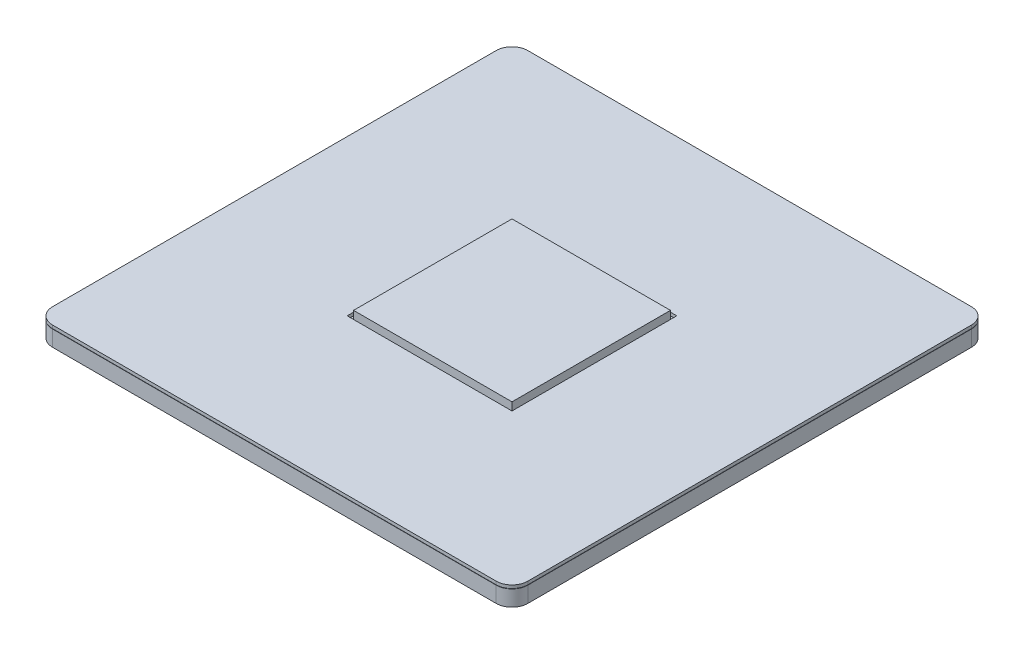
ISO-10303-21;
HEADER;
FILE_DESCRIPTION(('STEP AP214'),'2;1');
FILE_NAME('part.step','',(''),(''),'','','');
FILE_SCHEMA(('AUTOMOTIVE_DESIGN { 1 0 10303 214 1 1 1 1 }'));
ENDSEC;
DATA;
#1=APPLICATION_CONTEXT('core data for automotive mechanical design processes');
#2=APPLICATION_PROTOCOL_DEFINITION('international standard','automotive_design',2000,#1);
#3=PRODUCT_CONTEXT('',#1,'mechanical');
#4=PRODUCT('Part','Part','',(#3));
#5=PRODUCT_RELATED_PRODUCT_CATEGORY('part','',(#4));
#6=PRODUCT_DEFINITION_FORMATION('','',#4);
#7=PRODUCT_DEFINITION_CONTEXT('part definition',#1,'design');
#8=PRODUCT_DEFINITION('design','',#6,#7);
#9=PRODUCT_DEFINITION_SHAPE('','',#8);
#10=(LENGTH_UNIT() NAMED_UNIT(*) SI_UNIT(.MILLI.,.METRE.));
#11=(NAMED_UNIT(*) PLANE_ANGLE_UNIT() SI_UNIT($,.RADIAN.));
#12=(NAMED_UNIT(*) SI_UNIT($,.STERADIAN.) SOLID_ANGLE_UNIT());
#13=UNCERTAINTY_MEASURE_WITH_UNIT(LENGTH_MEASURE(1.E-05),#10,'distance_accuracy_value','');
#14=(GEOMETRIC_REPRESENTATION_CONTEXT(3) GLOBAL_UNCERTAINTY_ASSIGNED_CONTEXT((#13)) GLOBAL_UNIT_ASSIGNED_CONTEXT((#10,
#11,#12)) REPRESENTATION_CONTEXT('',''));
#15=CARTESIAN_POINT('',(0.,0.,0.));
#16=DIRECTION('',(0.,0.,1.));
#17=DIRECTION('',(1.,0.,0.));
#18=AXIS2_PLACEMENT_3D('',#15,#16,#17);
#19=CARTESIAN_POINT('',(2.50000000000001,0.76,2.5));
#20=DIRECTION('',(-1.,0.,0.));
#21=DIRECTION('',(0.,0.,1.));
#22=AXIS2_PLACEMENT_3D('',#19,#20,#21);
#23=PLANE('',#22);
#24=DIRECTION('',(0.,0.,-1.));
#25=VECTOR('',#24,1.);
#26=CARTESIAN_POINT('',(2.50000000000001,0.51,2.5));
#27=LINE('',#26,#25);
#28=CARTESIAN_POINT('',(2.50000000000001,0.51,2.5));
#29=VERTEX_POINT('',#28);
#30=CARTESIAN_POINT('',(2.50000000000001,0.51,-2.5));
#31=VERTEX_POINT('',#30);
#32=EDGE_CURVE('E108',#29,#31,#27,.T.);
#33=ORIENTED_EDGE('',*,*,#32,.T.);
#34=DIRECTION('',(0.,-1.,0.));
#35=VECTOR('',#34,1.);
#36=CARTESIAN_POINT('',(2.50000000000001,0.76,-2.5));
#37=LINE('',#36,#35);
#38=CARTESIAN_POINT('',(2.50000000000001,0.76,-2.5));
#39=VERTEX_POINT('',#38);
#40=EDGE_CURVE('E12',#39,#31,#37,.T.);
#41=ORIENTED_EDGE('',*,*,#40,.F.);
#42=DIRECTION('',(0.,0.,-1.));
#43=VECTOR('',#42,1.);
#44=CARTESIAN_POINT('',(2.50000000000001,0.76,2.5));
#45=LINE('',#44,#43);
#46=CARTESIAN_POINT('',(2.50000000000001,0.76,2.5));
#47=VERTEX_POINT('',#46);
#48=EDGE_CURVE('E96',#47,#39,#45,.T.);
#49=ORIENTED_EDGE('',*,*,#48,.F.);
#50=DIRECTION('',(0.,-1.,0.));
#51=VECTOR('',#50,1.);
#52=CARTESIAN_POINT('',(2.50000000000001,0.76,2.5));
#53=LINE('',#52,#51);
#54=EDGE_CURVE('E104',#47,#29,#53,.T.);
#55=ORIENTED_EDGE('',*,*,#54,.T.);
#56=EDGE_LOOP('',(#33,#41,#49,#55));
#57=FACE_BOUND('',#56,.T.);
#58=ADVANCED_FACE('F45',(#57),#23,.F.);
#59=CARTESIAN_POINT('',(-2.50000000000001,0.76,-2.5));
#60=DIRECTION('',(0.,0.,1.));
#61=DIRECTION('',(1.,0.,0.));
#62=AXIS2_PLACEMENT_3D('',#59,#60,#61);
#63=PLANE('',#62);
#64=DIRECTION('',(-1.,0.,0.));
#65=VECTOR('',#64,1.);
#66=CARTESIAN_POINT('',(-2.50000000000001,0.51,-2.5));
#67=LINE('',#66,#65);
#68=CARTESIAN_POINT('',(-2.50000000000001,0.51,-2.5));
#69=VERTEX_POINT('',#68);
#70=EDGE_CURVE('E100',#31,#69,#67,.T.);
#71=ORIENTED_EDGE('',*,*,#70,.T.);
#72=DIRECTION('',(0.,-1.,0.));
#73=VECTOR('',#72,1.);
#74=CARTESIAN_POINT('',(-2.50000000000001,0.76,-2.5));
#75=LINE('',#74,#73);
#76=CARTESIAN_POINT('',(-2.50000000000001,0.76,-2.5));
#77=VERTEX_POINT('',#76);
#78=EDGE_CURVE('E53',#77,#69,#75,.T.);
#79=ORIENTED_EDGE('',*,*,#78,.F.);
#80=DIRECTION('',(-1.,0.,0.));
#81=VECTOR('',#80,1.);
#82=CARTESIAN_POINT('',(-2.50000000000001,0.76,-2.5));
#83=LINE('',#82,#81);
#84=EDGE_CURVE('E91',#39,#77,#83,.T.);
#85=ORIENTED_EDGE('',*,*,#84,.F.);
#86=ORIENTED_EDGE('',*,*,#40,.T.);
#87=EDGE_LOOP('',(#71,#79,#85,#86));
#88=FACE_BOUND('',#87,.T.);
#89=ADVANCED_FACE('F99',(#88),#63,.F.);
#90=CARTESIAN_POINT('',(-2.50000000000001,0.76,2.5));
#91=DIRECTION('',(1.,0.,0.));
#92=DIRECTION('',(0.,0.,-1.));
#93=AXIS2_PLACEMENT_3D('',#90,#91,#92);
#94=PLANE('',#93);
#95=DIRECTION('',(0.,0.,1.));
#96=VECTOR('',#95,1.);
#97=CARTESIAN_POINT('',(-2.50000000000001,0.51,2.5));
#98=LINE('',#97,#96);
#99=CARTESIAN_POINT('',(-2.50000000000001,0.51,2.5));
#100=VERTEX_POINT('',#99);
#101=EDGE_CURVE('E78',#69,#100,#98,.T.);
#102=ORIENTED_EDGE('',*,*,#101,.T.);
#103=DIRECTION('',(0.,-1.,0.));
#104=VECTOR('',#103,1.);
#105=CARTESIAN_POINT('',(-2.50000000000001,0.76,2.5));
#106=LINE('',#105,#104);
#107=CARTESIAN_POINT('',(-2.50000000000001,0.76,2.5));
#108=VERTEX_POINT('',#107);
#109=EDGE_CURVE('E101',#108,#100,#106,.T.);
#110=ORIENTED_EDGE('',*,*,#109,.F.);
#111=DIRECTION('',(0.,0.,1.));
#112=VECTOR('',#111,1.);
#113=CARTESIAN_POINT('',(-2.50000000000001,0.76,2.5));
#114=LINE('',#113,#112);
#115=EDGE_CURVE('E94',#77,#108,#114,.T.);
#116=ORIENTED_EDGE('',*,*,#115,.F.);
#117=ORIENTED_EDGE('',*,*,#78,.T.);
#118=EDGE_LOOP('',(#102,#110,#116,#117));
#119=FACE_BOUND('',#118,.T.);
#120=ADVANCED_FACE('F102',(#119),#94,.F.);
#121=CARTESIAN_POINT('',(-2.50000000000001,0.76,2.5));
#122=DIRECTION('',(0.,0.,-1.));
#123=DIRECTION('',(-1.,0.,0.));
#124=AXIS2_PLACEMENT_3D('',#121,#122,#123);
#125=PLANE('',#124);
#126=DIRECTION('',(1.,0.,0.));
#127=VECTOR('',#126,1.);
#128=CARTESIAN_POINT('',(-2.50000000000001,0.51,2.5));
#129=LINE('',#128,#127);
#130=EDGE_CURVE('E84',#100,#29,#129,.T.);
#131=ORIENTED_EDGE('',*,*,#130,.T.);
#132=ORIENTED_EDGE('',*,*,#54,.F.);
#133=DIRECTION('',(1.,0.,0.));
#134=VECTOR('',#133,1.);
#135=CARTESIAN_POINT('',(-2.50000000000001,0.76,2.5));
#136=LINE('',#135,#134);
#137=EDGE_CURVE('E61',#108,#47,#136,.T.);
#138=ORIENTED_EDGE('',*,*,#137,.F.);
#139=ORIENTED_EDGE('',*,*,#109,.T.);
#140=EDGE_LOOP('',(#131,#132,#138,#139));
#141=FACE_BOUND('',#140,.T.);
#142=ADVANCED_FACE('F115',(#141),#125,.F.);
#143=CARTESIAN_POINT('',(0.,0.76,0.));
#144=DIRECTION('',(0.,-1.,0.));
#145=DIRECTION('',(0.,0.,-1.));
#146=AXIS2_PLACEMENT_3D('',#143,#144,#145);
#147=PLANE('',#146);
#148=ORIENTED_EDGE('',*,*,#48,.T.);
#149=ORIENTED_EDGE('',*,*,#84,.T.);
#150=ORIENTED_EDGE('',*,*,#115,.T.);
#151=ORIENTED_EDGE('',*,*,#137,.T.);
#152=EDGE_LOOP('',(#148,#149,#150,#151));
#153=FACE_BOUND('',#152,.T.);
#154=ADVANCED_FACE('F92',(#153),#147,.F.);
#155=CARTESIAN_POINT('',(0.,0.51,0.));
#156=DIRECTION('',(0.,-1.,0.));
#157=DIRECTION('',(0.,0.,-1.));
#158=AXIS2_PLACEMENT_3D('',#155,#156,#157);
#159=PLANE('',#158);
#160=ORIENTED_EDGE('',*,*,#32,.F.);
#161=ORIENTED_EDGE('',*,*,#130,.F.);
#162=ORIENTED_EDGE('',*,*,#101,.F.);
#163=ORIENTED_EDGE('',*,*,#70,.F.);
#164=EDGE_LOOP('',(#160,#161,#162,#163));
#165=FACE_BOUND('',#164,.T.);
#166=ADVANCED_FACE('F118',(#165),#159,.T.);
#167=CLOSED_SHELL('',(#58,#89,#120,#142,#154,#166));
#168=MANIFOLD_SOLID_BREP('B2',#167);
#169=CARTESIAN_POINT('',(-7.,0.61,-7.));
#170=DIRECTION('',(0.,1.,0.));
#171=DIRECTION('',(0.,0.,1.));
#172=AXIS2_PLACEMENT_3D('',#169,#170,#171);
#173=PLANE('',#172);
#174=CARTESIAN_POINT('',(-7.,0.61,-7.));
#175=DIRECTION('',(0.,1.,0.));
#176=DIRECTION('',(0.,0.,1.));
#177=AXIS2_PLACEMENT_3D('',#174,#175,#176);
#178=CIRCLE('',#177,0.5);
#179=CARTESIAN_POINT('',(-7.,0.61,-7.5));
#180=VERTEX_POINT('',#179);
#181=CARTESIAN_POINT('',(-7.5,0.61,-7.));
#182=VERTEX_POINT('',#181);
#183=EDGE_CURVE('E302',#180,#182,#178,.T.);
#184=ORIENTED_EDGE('',*,*,#183,.T.);
#185=DIRECTION('',(0.,0.,1.));
#186=VECTOR('',#185,1.);
#187=CARTESIAN_POINT('',(-7.5,0.61,-7.));
#188=LINE('',#187,#186);
#189=CARTESIAN_POINT('',(-7.5,0.61,7.));
#190=VERTEX_POINT('',#189);
#191=EDGE_CURVE('E305',#182,#190,#188,.T.);
#192=ORIENTED_EDGE('',*,*,#191,.T.);
#193=CARTESIAN_POINT('',(-7.,0.61,7.));
#194=DIRECTION('',(0.,1.,0.));
#195=DIRECTION('',(0.,0.,1.));
#196=AXIS2_PLACEMENT_3D('',#193,#194,#195);
#197=CIRCLE('',#196,0.5);
#198=CARTESIAN_POINT('',(-7.,0.61,7.5));
#199=VERTEX_POINT('',#198);
#200=EDGE_CURVE('E308',#190,#199,#197,.T.);
#201=ORIENTED_EDGE('',*,*,#200,.T.);
#202=DIRECTION('',(1.,0.,0.));
#203=VECTOR('',#202,1.);
#204=CARTESIAN_POINT('',(-7.,0.61,7.5));
#205=LINE('',#204,#203);
#206=CARTESIAN_POINT('',(7.,0.61,7.5));
#207=VERTEX_POINT('',#206);
#208=EDGE_CURVE('E310',#199,#207,#205,.T.);
#209=ORIENTED_EDGE('',*,*,#208,.T.);
#210=CARTESIAN_POINT('',(7.,0.61,7.));
#211=DIRECTION('',(0.,1.,0.));
#212=DIRECTION('',(0.,0.,1.));
#213=AXIS2_PLACEMENT_3D('',#210,#211,#212);
#214=CIRCLE('',#213,0.5);
#215=CARTESIAN_POINT('',(7.5,0.61,7.));
#216=VERTEX_POINT('',#215);
#217=EDGE_CURVE('E312',#207,#216,#214,.T.);
#218=ORIENTED_EDGE('',*,*,#217,.T.);
#219=DIRECTION('',(0.,0.,-1.));
#220=VECTOR('',#219,1.);
#221=CARTESIAN_POINT('',(7.5,0.61,7.));
#222=LINE('',#221,#220);
#223=CARTESIAN_POINT('',(7.5,0.61,-7.));
#224=VERTEX_POINT('',#223);
#225=EDGE_CURVE('E314',#216,#224,#222,.T.);
#226=ORIENTED_EDGE('',*,*,#225,.T.);
#227=CARTESIAN_POINT('',(7.,0.61,-7.));
#228=DIRECTION('',(0.,1.,0.));
#229=DIRECTION('',(0.,0.,1.));
#230=AXIS2_PLACEMENT_3D('',#227,#228,#229);
#231=CIRCLE('',#230,0.5);
#232=CARTESIAN_POINT('',(7.,0.61,-7.5));
#233=VERTEX_POINT('',#232);
#234=EDGE_CURVE('E316',#224,#233,#231,.T.);
#235=ORIENTED_EDGE('',*,*,#234,.T.);
#236=DIRECTION('',(-1.,0.,0.));
#237=VECTOR('',#236,1.);
#238=CARTESIAN_POINT('',(7.,0.61,-7.5));
#239=LINE('',#238,#237);
#240=EDGE_CURVE('E318',#233,#180,#239,.T.);
#241=ORIENTED_EDGE('',*,*,#240,.T.);
#242=EDGE_LOOP('',(#184,#192,#201,#209,#218,#226,#235,#241));
#243=FACE_BOUND('',#242,.T.);
#244=DIRECTION('',(-1.,0.,0.));
#245=VECTOR('',#244,1.);
#246=CARTESIAN_POINT('',(-2.6,0.61,-2.60000000000001));
#247=LINE('',#246,#245);
#248=CARTESIAN_POINT('',(2.6,0.61,-2.60000000000001));
#249=VERTEX_POINT('',#248);
#250=CARTESIAN_POINT('',(-2.6,0.61,-2.60000000000001));
#251=VERTEX_POINT('',#250);
#252=EDGE_CURVE('E274',#249,#251,#247,.T.);
#253=ORIENTED_EDGE('',*,*,#252,.F.);
#254=DIRECTION('',(0.,0.,-1.));
#255=VECTOR('',#254,1.);
#256=CARTESIAN_POINT('',(2.6,0.61,2.60000000000001));
#257=LINE('',#256,#255);
#258=CARTESIAN_POINT('',(2.6,0.61,2.60000000000001));
#259=VERTEX_POINT('',#258);
#260=EDGE_CURVE('E266',#259,#249,#257,.T.);
#261=ORIENTED_EDGE('',*,*,#260,.F.);
#262=DIRECTION('',(1.,0.,0.));
#263=VECTOR('',#262,1.);
#264=CARTESIAN_POINT('',(-2.6,0.61,2.60000000000001));
#265=LINE('',#264,#263);
#266=CARTESIAN_POINT('',(-2.6,0.61,2.60000000000001));
#267=VERTEX_POINT('',#266);
#268=EDGE_CURVE('E288',#267,#259,#265,.T.);
#269=ORIENTED_EDGE('',*,*,#268,.F.);
#270=DIRECTION('',(0.,0.,1.));
#271=VECTOR('',#270,1.);
#272=CARTESIAN_POINT('',(-2.6,0.61,2.60000000000001));
#273=LINE('',#272,#271);
#274=EDGE_CURVE('E286',#251,#267,#273,.T.);
#275=ORIENTED_EDGE('',*,*,#274,.F.);
#276=EDGE_LOOP('',(#253,#261,#269,#275));
#277=FACE_BOUND('',#276,.T.);
#278=ADVANCED_FACE('F177',(#243,#277),#173,.T.);
#279=CARTESIAN_POINT('',(-7.,0.51,-7.));
#280=DIRECTION('',(0.,1.,0.));
#281=DIRECTION('',(0.,0.,1.));
#282=AXIS2_PLACEMENT_3D('',#279,#280,#281);
#283=PLANE('',#282);
#284=CARTESIAN_POINT('',(-7.,0.51,-7.));
#285=DIRECTION('',(0.,1.,0.));
#286=DIRECTION('',(0.,0.,1.));
#287=AXIS2_PLACEMENT_3D('',#284,#285,#286);
#288=CIRCLE('',#287,0.5);
#289=CARTESIAN_POINT('',(-7.,0.51,-7.5));
#290=VERTEX_POINT('',#289);
#291=CARTESIAN_POINT('',(-7.5,0.51,-7.));
#292=VERTEX_POINT('',#291);
#293=EDGE_CURVE('E282',#290,#292,#288,.T.);
#294=ORIENTED_EDGE('',*,*,#293,.F.);
#295=DIRECTION('',(-1.,0.,0.));
#296=VECTOR('',#295,1.);
#297=CARTESIAN_POINT('',(7.,0.51,-7.5));
#298=LINE('',#297,#296);
#299=CARTESIAN_POINT('',(7.,0.51,-7.5));
#300=VERTEX_POINT('',#299);
#301=EDGE_CURVE('E306',#300,#290,#298,.T.);
#302=ORIENTED_EDGE('',*,*,#301,.F.);
#303=CARTESIAN_POINT('',(7.,0.51,-7.));
#304=DIRECTION('',(0.,1.,0.));
#305=DIRECTION('',(0.,0.,1.));
#306=AXIS2_PLACEMENT_3D('',#303,#304,#305);
#307=CIRCLE('',#306,0.5);
#308=CARTESIAN_POINT('',(7.5,0.51,-7.));
#309=VERTEX_POINT('',#308);
#310=EDGE_CURVE('E333',#309,#300,#307,.T.);
#311=ORIENTED_EDGE('',*,*,#310,.F.);
#312=DIRECTION('',(0.,0.,-1.));
#313=VECTOR('',#312,1.);
#314=CARTESIAN_POINT('',(7.5,0.51,7.));
#315=LINE('',#314,#313);
#316=CARTESIAN_POINT('',(7.5,0.51,7.));
#317=VERTEX_POINT('',#316);
#318=EDGE_CURVE('E331',#317,#309,#315,.T.);
#319=ORIENTED_EDGE('',*,*,#318,.F.);
#320=CARTESIAN_POINT('',(7.,0.51,7.));
#321=DIRECTION('',(0.,1.,0.));
#322=DIRECTION('',(0.,0.,1.));
#323=AXIS2_PLACEMENT_3D('',#320,#321,#322);
#324=CIRCLE('',#323,0.5);
#325=CARTESIAN_POINT('',(7.,0.51,7.5));
#326=VERTEX_POINT('',#325);
#327=EDGE_CURVE('E329',#326,#317,#324,.T.);
#328=ORIENTED_EDGE('',*,*,#327,.F.);
#329=DIRECTION('',(1.,0.,0.));
#330=VECTOR('',#329,1.);
#331=CARTESIAN_POINT('',(-7.,0.51,7.5));
#332=LINE('',#331,#330);
#333=CARTESIAN_POINT('',(-7.,0.51,7.5));
#334=VERTEX_POINT('',#333);
#335=EDGE_CURVE('E327',#334,#326,#332,.T.);
#336=ORIENTED_EDGE('',*,*,#335,.F.);
#337=CARTESIAN_POINT('',(-7.,0.51,7.));
#338=DIRECTION('',(0.,1.,0.));
#339=DIRECTION('',(0.,0.,1.));
#340=AXIS2_PLACEMENT_3D('',#337,#338,#339);
#341=CIRCLE('',#340,0.5);
#342=CARTESIAN_POINT('',(-7.5,0.51,7.));
#343=VERTEX_POINT('',#342);
#344=EDGE_CURVE('E325',#343,#334,#341,.T.);
#345=ORIENTED_EDGE('',*,*,#344,.F.);
#346=DIRECTION('',(0.,0.,1.));
#347=VECTOR('',#346,1.);
#348=CARTESIAN_POINT('',(-7.5,0.51,-7.));
#349=LINE('',#348,#347);
#350=EDGE_CURVE('E323',#292,#343,#349,.T.);
#351=ORIENTED_EDGE('',*,*,#350,.F.);
#352=EDGE_LOOP('',(#294,#302,#311,#319,#328,#336,#345,#351));
#353=FACE_BOUND('',#352,.T.);
#354=DIRECTION('',(0.,0.,-1.));
#355=VECTOR('',#354,1.);
#356=CARTESIAN_POINT('',(2.6,0.51,2.60000000000001));
#357=LINE('',#356,#355);
#358=CARTESIAN_POINT('',(2.6,0.51,2.60000000000001));
#359=VERTEX_POINT('',#358);
#360=CARTESIAN_POINT('',(2.6,0.51,-2.60000000000001));
#361=VERTEX_POINT('',#360);
#362=EDGE_CURVE('E200',#359,#361,#357,.T.);
#363=ORIENTED_EDGE('',*,*,#362,.T.);
#364=DIRECTION('',(-1.,0.,0.));
#365=VECTOR('',#364,1.);
#366=CARTESIAN_POINT('',(-2.6,0.51,-2.60000000000001));
#367=LINE('',#366,#365);
#368=CARTESIAN_POINT('',(-2.6,0.51,-2.60000000000001));
#369=VERTEX_POINT('',#368);
#370=EDGE_CURVE('E281',#361,#369,#367,.T.);
#371=ORIENTED_EDGE('',*,*,#370,.T.);
#372=DIRECTION('',(0.,0.,1.));
#373=VECTOR('',#372,1.);
#374=CARTESIAN_POINT('',(-2.6,0.51,2.60000000000001));
#375=LINE('',#374,#373);
#376=CARTESIAN_POINT('',(-2.6,0.51,2.60000000000001));
#377=VERTEX_POINT('',#376);
#378=EDGE_CURVE('E294',#369,#377,#375,.T.);
#379=ORIENTED_EDGE('',*,*,#378,.T.);
#380=DIRECTION('',(1.,0.,0.));
#381=VECTOR('',#380,1.);
#382=CARTESIAN_POINT('',(-2.6,0.51,2.60000000000001));
#383=LINE('',#382,#381);
#384=EDGE_CURVE('E275',#377,#359,#383,.T.);
#385=ORIENTED_EDGE('',*,*,#384,.T.);
#386=EDGE_LOOP('',(#363,#371,#379,#385));
#387=FACE_BOUND('',#386,.T.);
#388=ADVANCED_FACE('F363',(#353,#387),#283,.F.);
#389=CARTESIAN_POINT('',(-7.,0.61,-7.));
#390=DIRECTION('',(0.,-1.,0.));
#391=DIRECTION('',(0.,0.,-1.));
#392=AXIS2_PLACEMENT_3D('',#389,#390,#391);
#393=CYLINDRICAL_SURFACE('',#392,0.5);
#394=ORIENTED_EDGE('',*,*,#293,.T.);
#395=DIRECTION('',(0.,-1.,0.));
#396=VECTOR('',#395,1.);
#397=CARTESIAN_POINT('',(-7.5,0.61,-7.));
#398=LINE('',#397,#396);
#399=EDGE_CURVE('E43',#182,#292,#398,.T.);
#400=ORIENTED_EDGE('',*,*,#399,.F.);
#401=ORIENTED_EDGE('',*,*,#183,.F.);
#402=DIRECTION('',(0.,-1.,0.));
#403=VECTOR('',#402,1.);
#404=CARTESIAN_POINT('',(-7.,0.61,-7.5));
#405=LINE('',#404,#403);
#406=EDGE_CURVE('E320',#180,#290,#405,.T.);
#407=ORIENTED_EDGE('',*,*,#406,.T.);
#408=EDGE_LOOP('',(#394,#400,#401,#407));
#409=FACE_BOUND('',#408,.T.);
#410=ADVANCED_FACE('F179',(#409),#393,.T.);
#411=CARTESIAN_POINT('',(-7.5,0.61,-7.));
#412=DIRECTION('',(1.,0.,0.));
#413=DIRECTION('',(0.,0.,-1.));
#414=AXIS2_PLACEMENT_3D('',#411,#412,#413);
#415=PLANE('',#414);
#416=ORIENTED_EDGE('',*,*,#350,.T.);
#417=DIRECTION('',(0.,-1.,0.));
#418=VECTOR('',#417,1.);
#419=CARTESIAN_POINT('',(-7.5,0.61,7.));
#420=LINE('',#419,#418);
#421=EDGE_CURVE('E185',#190,#343,#420,.T.);
#422=ORIENTED_EDGE('',*,*,#421,.F.);
#423=ORIENTED_EDGE('',*,*,#191,.F.);
#424=ORIENTED_EDGE('',*,*,#399,.T.);
#425=EDGE_LOOP('',(#416,#422,#423,#424));
#426=FACE_BOUND('',#425,.T.);
#427=ADVANCED_FACE('F380',(#426),#415,.F.);
#428=CARTESIAN_POINT('',(-7.,0.61,7.));
#429=DIRECTION('',(0.,-1.,0.));
#430=DIRECTION('',(0.,0.,-1.));
#431=AXIS2_PLACEMENT_3D('',#428,#429,#430);
#432=CYLINDRICAL_SURFACE('',#431,0.5);
#433=ORIENTED_EDGE('',*,*,#344,.T.);
#434=DIRECTION('',(0.,-1.,0.));
#435=VECTOR('',#434,1.);
#436=CARTESIAN_POINT('',(-7.,0.61,7.5));
#437=LINE('',#436,#435);
#438=EDGE_CURVE('E350',#199,#334,#437,.T.);
#439=ORIENTED_EDGE('',*,*,#438,.F.);
#440=ORIENTED_EDGE('',*,*,#200,.F.);
#441=ORIENTED_EDGE('',*,*,#421,.T.);
#442=EDGE_LOOP('',(#433,#439,#440,#441));
#443=FACE_BOUND('',#442,.T.);
#444=ADVANCED_FACE('F357',(#443),#432,.T.);
#445=CARTESIAN_POINT('',(-7.,0.61,7.5));
#446=DIRECTION('',(0.,0.,-1.));
#447=DIRECTION('',(-1.,0.,0.));
#448=AXIS2_PLACEMENT_3D('',#445,#446,#447);
#449=PLANE('',#448);
#450=ORIENTED_EDGE('',*,*,#335,.T.);
#451=DIRECTION('',(0.,-1.,0.));
#452=VECTOR('',#451,1.);
#453=CARTESIAN_POINT('',(7.,0.61,7.5));
#454=LINE('',#453,#452);
#455=EDGE_CURVE('E347',#207,#326,#454,.T.);
#456=ORIENTED_EDGE('',*,*,#455,.F.);
#457=ORIENTED_EDGE('',*,*,#208,.F.);
#458=ORIENTED_EDGE('',*,*,#438,.T.);
#459=EDGE_LOOP('',(#450,#456,#457,#458));
#460=FACE_BOUND('',#459,.T.);
#461=ADVANCED_FACE('F369',(#460),#449,.F.);
#462=CARTESIAN_POINT('',(7.,0.61,7.));
#463=DIRECTION('',(0.,-1.,0.));
#464=DIRECTION('',(0.,0.,-1.));
#465=AXIS2_PLACEMENT_3D('',#462,#463,#464);
#466=CYLINDRICAL_SURFACE('',#465,0.5);
#467=ORIENTED_EDGE('',*,*,#327,.T.);
#468=DIRECTION('',(0.,-1.,0.));
#469=VECTOR('',#468,1.);
#470=CARTESIAN_POINT('',(7.5,0.61,7.));
#471=LINE('',#470,#469);
#472=EDGE_CURVE('E344',#216,#317,#471,.T.);
#473=ORIENTED_EDGE('',*,*,#472,.F.);
#474=ORIENTED_EDGE('',*,*,#217,.F.);
#475=ORIENTED_EDGE('',*,*,#455,.T.);
#476=EDGE_LOOP('',(#467,#473,#474,#475));
#477=FACE_BOUND('',#476,.T.);
#478=ADVANCED_FACE('F373',(#477),#466,.T.);
#479=CARTESIAN_POINT('',(7.5,0.61,7.));
#480=DIRECTION('',(-1.,0.,0.));
#481=DIRECTION('',(0.,0.,1.));
#482=AXIS2_PLACEMENT_3D('',#479,#480,#481);
#483=PLANE('',#482);
#484=ORIENTED_EDGE('',*,*,#318,.T.);
#485=DIRECTION('',(0.,-1.,0.));
#486=VECTOR('',#485,1.);
#487=CARTESIAN_POINT('',(7.5,0.61,-7.));
#488=LINE('',#487,#486);
#489=EDGE_CURVE('E341',#224,#309,#488,.T.);
#490=ORIENTED_EDGE('',*,*,#489,.F.);
#491=ORIENTED_EDGE('',*,*,#225,.F.);
#492=ORIENTED_EDGE('',*,*,#472,.T.);
#493=EDGE_LOOP('',(#484,#490,#491,#492));
#494=FACE_BOUND('',#493,.T.);
#495=ADVANCED_FACE('F393',(#494),#483,.F.);
#496=CARTESIAN_POINT('',(7.,0.61,-7.));
#497=DIRECTION('',(0.,-1.,0.));
#498=DIRECTION('',(0.,0.,-1.));
#499=AXIS2_PLACEMENT_3D('',#496,#497,#498);
#500=CYLINDRICAL_SURFACE('',#499,0.5);
#501=ORIENTED_EDGE('',*,*,#310,.T.);
#502=DIRECTION('',(0.,-1.,0.));
#503=VECTOR('',#502,1.);
#504=CARTESIAN_POINT('',(7.,0.61,-7.5));
#505=LINE('',#504,#503);
#506=EDGE_CURVE('E338',#233,#300,#505,.T.);
#507=ORIENTED_EDGE('',*,*,#506,.F.);
#508=ORIENTED_EDGE('',*,*,#234,.F.);
#509=ORIENTED_EDGE('',*,*,#489,.T.);
#510=EDGE_LOOP('',(#501,#507,#508,#509));
#511=FACE_BOUND('',#510,.T.);
#512=ADVANCED_FACE('F391',(#511),#500,.T.);
#513=CARTESIAN_POINT('',(7.,0.61,-7.5));
#514=DIRECTION('',(0.,0.,1.));
#515=DIRECTION('',(1.,0.,0.));
#516=AXIS2_PLACEMENT_3D('',#513,#514,#515);
#517=PLANE('',#516);
#518=ORIENTED_EDGE('',*,*,#301,.T.);
#519=ORIENTED_EDGE('',*,*,#406,.F.);
#520=ORIENTED_EDGE('',*,*,#240,.F.);
#521=ORIENTED_EDGE('',*,*,#506,.T.);
#522=EDGE_LOOP('',(#518,#519,#520,#521));
#523=FACE_BOUND('',#522,.T.);
#524=ADVANCED_FACE('F386',(#523),#517,.F.);
#525=CARTESIAN_POINT('',(2.6,0.61,2.60000000000001));
#526=DIRECTION('',(-1.,0.,0.));
#527=DIRECTION('',(0.,0.,1.));
#528=AXIS2_PLACEMENT_3D('',#525,#526,#527);
#529=PLANE('',#528);
#530=ORIENTED_EDGE('',*,*,#362,.F.);
#531=DIRECTION('',(0.,-1.,0.));
#532=VECTOR('',#531,1.);
#533=CARTESIAN_POINT('',(2.6,0.61,2.60000000000001));
#534=LINE('',#533,#532);
#535=EDGE_CURVE('E270',#259,#359,#534,.T.);
#536=ORIENTED_EDGE('',*,*,#535,.F.);
#537=ORIENTED_EDGE('',*,*,#260,.T.);
#538=DIRECTION('',(0.,-1.,0.));
#539=VECTOR('',#538,1.);
#540=CARTESIAN_POINT('',(2.6,0.61,-2.60000000000001));
#541=LINE('',#540,#539);
#542=EDGE_CURVE('E269',#249,#361,#541,.T.);
#543=ORIENTED_EDGE('',*,*,#542,.T.);
#544=EDGE_LOOP('',(#530,#536,#537,#543));
#545=FACE_BOUND('',#544,.T.);
#546=ADVANCED_FACE('F268',(#545),#529,.T.);
#547=CARTESIAN_POINT('',(-2.6,0.61,-2.60000000000001));
#548=DIRECTION('',(0.,0.,1.));
#549=DIRECTION('',(1.,0.,0.));
#550=AXIS2_PLACEMENT_3D('',#547,#548,#549);
#551=PLANE('',#550);
#552=ORIENTED_EDGE('',*,*,#370,.F.);
#553=ORIENTED_EDGE('',*,*,#542,.F.);
#554=ORIENTED_EDGE('',*,*,#252,.T.);
#555=DIRECTION('',(0.,-1.,0.));
#556=VECTOR('',#555,1.);
#557=CARTESIAN_POINT('',(-2.6,0.61,-2.60000000000001));
#558=LINE('',#557,#556);
#559=EDGE_CURVE('E283',#251,#369,#558,.T.);
#560=ORIENTED_EDGE('',*,*,#559,.T.);
#561=EDGE_LOOP('',(#552,#553,#554,#560));
#562=FACE_BOUND('',#561,.T.);
#563=ADVANCED_FACE('F278',(#562),#551,.T.);
#564=CARTESIAN_POINT('',(-2.6,0.61,2.60000000000001));
#565=DIRECTION('',(1.,0.,0.));
#566=DIRECTION('',(0.,0.,-1.));
#567=AXIS2_PLACEMENT_3D('',#564,#565,#566);
#568=PLANE('',#567);
#569=ORIENTED_EDGE('',*,*,#378,.F.);
#570=ORIENTED_EDGE('',*,*,#559,.F.);
#571=ORIENTED_EDGE('',*,*,#274,.T.);
#572=DIRECTION('',(0.,-1.,0.));
#573=VECTOR('',#572,1.);
#574=CARTESIAN_POINT('',(-2.6,0.61,2.60000000000001));
#575=LINE('',#574,#573);
#576=EDGE_CURVE('E192',#267,#377,#575,.T.);
#577=ORIENTED_EDGE('',*,*,#576,.T.);
#578=EDGE_LOOP('',(#569,#570,#571,#577));
#579=FACE_BOUND('',#578,.T.);
#580=ADVANCED_FACE('F418',(#579),#568,.T.);
#581=CARTESIAN_POINT('',(-2.6,0.61,2.60000000000001));
#582=DIRECTION('',(0.,0.,-1.));
#583=DIRECTION('',(-1.,0.,0.));
#584=AXIS2_PLACEMENT_3D('',#581,#582,#583);
#585=PLANE('',#584);
#586=ORIENTED_EDGE('',*,*,#384,.F.);
#587=ORIENTED_EDGE('',*,*,#576,.F.);
#588=ORIENTED_EDGE('',*,*,#268,.T.);
#589=ORIENTED_EDGE('',*,*,#535,.T.);
#590=EDGE_LOOP('',(#586,#587,#588,#589));
#591=FACE_BOUND('',#590,.T.);
#592=ADVANCED_FACE('F422',(#591),#585,.T.);
#593=CLOSED_SHELL('',(#278,#388,#410,#427,#444,#461,#478,#495,#512,#524,#546,#563,#580,#592));
#594=MANIFOLD_SOLID_BREP('B6',#593);
#595=CARTESIAN_POINT('',(7.5,0.5,7.5));
#596=DIRECTION('',(-1.,0.,0.));
#597=DIRECTION('',(0.,0.,1.));
#598=AXIS2_PLACEMENT_3D('',#595,#596,#597);
#599=PLANE('',#598);
#600=DIRECTION('',(0.,0.,-1.));
#601=VECTOR('',#600,1.);
#602=CARTESIAN_POINT('',(7.5,0.,7.5));
#603=LINE('',#602,#601);
#604=CARTESIAN_POINT('',(7.5,0.,7.));
#605=VERTEX_POINT('',#604);
#606=CARTESIAN_POINT('',(7.5,0.,-7.));
#607=VERTEX_POINT('',#606);
#608=EDGE_CURVE('E634',#605,#607,#603,.T.);
#609=ORIENTED_EDGE('',*,*,#608,.T.);
#610=DIRECTION('',(0.,-1.,0.));
#611=VECTOR('',#610,1.);
#612=CARTESIAN_POINT('',(7.5,0.5,-7.));
#613=LINE('',#612,#611);
#614=CARTESIAN_POINT('',(7.5,0.5,-7.));
#615=VERTEX_POINT('',#614);
#616=EDGE_CURVE('E175',#607,#615,#613,.F.);
#617=ORIENTED_EDGE('',*,*,#616,.T.);
#618=DIRECTION('',(0.,0.,-1.));
#619=VECTOR('',#618,1.);
#620=CARTESIAN_POINT('',(7.5,0.5,7.5));
#621=LINE('',#620,#619);
#622=CARTESIAN_POINT('',(7.5,0.5,7.));
#623=VERTEX_POINT('',#622);
#624=EDGE_CURVE('E602',#623,#615,#621,.T.);
#625=ORIENTED_EDGE('',*,*,#624,.F.);
#626=DIRECTION('',(0.,-1.,0.));
#627=VECTOR('',#626,1.);
#628=CARTESIAN_POINT('',(7.5,0.5,7.));
#629=LINE('',#628,#627);
#630=EDGE_CURVE('E518',#623,#605,#629,.T.);
#631=ORIENTED_EDGE('',*,*,#630,.T.);
#632=EDGE_LOOP('',(#609,#617,#625,#631));
#633=FACE_BOUND('',#632,.T.);
#634=ADVANCED_FACE('F510',(#633),#599,.F.);
#635=CARTESIAN_POINT('',(-7.5,0.5,-7.5));
#636=DIRECTION('',(0.,0.,1.));
#637=DIRECTION('',(1.,0.,0.));
#638=AXIS2_PLACEMENT_3D('',#635,#636,#637);
#639=PLANE('',#638);
#640=DIRECTION('',(-1.,0.,0.));
#641=VECTOR('',#640,1.);
#642=CARTESIAN_POINT('',(-7.5,0.,-7.5));
#643=LINE('',#642,#641);
#644=CARTESIAN_POINT('',(7.,0.,-7.5));
#645=VERTEX_POINT('',#644);
#646=CARTESIAN_POINT('',(-7.,0.,-7.5));
#647=VERTEX_POINT('',#646);
#648=EDGE_CURVE('E607',#645,#647,#643,.T.);
#649=ORIENTED_EDGE('',*,*,#648,.T.);
#650=DIRECTION('',(0.,-1.,0.));
#651=VECTOR('',#650,1.);
#652=CARTESIAN_POINT('',(-7.,0.5,-7.5));
#653=LINE('',#652,#651);
#654=CARTESIAN_POINT('',(-7.,0.5,-7.5));
#655=VERTEX_POINT('',#654);
#656=EDGE_CURVE('E525',#647,#655,#653,.F.);
#657=ORIENTED_EDGE('',*,*,#656,.T.);
#658=DIRECTION('',(-1.,0.,0.));
#659=VECTOR('',#658,1.);
#660=CARTESIAN_POINT('',(-7.5,0.5,-7.5));
#661=LINE('',#660,#659);
#662=CARTESIAN_POINT('',(7.,0.5,-7.5));
#663=VERTEX_POINT('',#662);
#664=EDGE_CURVE('E605',#663,#655,#661,.T.);
#665=ORIENTED_EDGE('',*,*,#664,.F.);
#666=DIRECTION('',(0.,-1.,0.));
#667=VECTOR('',#666,1.);
#668=CARTESIAN_POINT('',(7.,0.5,-7.5));
#669=LINE('',#668,#667);
#670=EDGE_CURVE('E626',#663,#645,#669,.T.);
#671=ORIENTED_EDGE('',*,*,#670,.T.);
#672=EDGE_LOOP('',(#649,#657,#665,#671));
#673=FACE_BOUND('',#672,.T.);
#674=ADVANCED_FACE('F654',(#673),#639,.F.);
#675=CARTESIAN_POINT('',(-7.5,0.5,7.5));
#676=DIRECTION('',(1.,0.,0.));
#677=DIRECTION('',(0.,0.,-1.));
#678=AXIS2_PLACEMENT_3D('',#675,#676,#677);
#679=PLANE('',#678);
#680=DIRECTION('',(0.,0.,1.));
#681=VECTOR('',#680,1.);
#682=CARTESIAN_POINT('',(-7.5,0.,7.5));
#683=LINE('',#682,#681);
#684=CARTESIAN_POINT('',(-7.5,0.,-7.));
#685=VERTEX_POINT('',#684);
#686=CARTESIAN_POINT('',(-7.5,0.,7.));
#687=VERTEX_POINT('',#686);
#688=EDGE_CURVE('E603',#685,#687,#683,.T.);
#689=ORIENTED_EDGE('',*,*,#688,.T.);
#690=DIRECTION('',(0.,-1.,0.));
#691=VECTOR('',#690,1.);
#692=CARTESIAN_POINT('',(-7.5,0.5,7.));
#693=LINE('',#692,#691);
#694=CARTESIAN_POINT('',(-7.5,0.5,7.));
#695=VERTEX_POINT('',#694);
#696=EDGE_CURVE('E581',#687,#695,#693,.F.);
#697=ORIENTED_EDGE('',*,*,#696,.T.);
#698=DIRECTION('',(0.,0.,1.));
#699=VECTOR('',#698,1.);
#700=CARTESIAN_POINT('',(-7.5,0.5,7.5));
#701=LINE('',#700,#699);
#702=CARTESIAN_POINT('',(-7.5,0.5,-7.));
#703=VERTEX_POINT('',#702);
#704=EDGE_CURVE('E642',#703,#695,#701,.T.);
#705=ORIENTED_EDGE('',*,*,#704,.F.);
#706=DIRECTION('',(0.,-1.,0.));
#707=VECTOR('',#706,1.);
#708=CARTESIAN_POINT('',(-7.5,0.5,-7.));
#709=LINE('',#708,#707);
#710=EDGE_CURVE('E586',#703,#685,#709,.T.);
#711=ORIENTED_EDGE('',*,*,#710,.T.);
#712=EDGE_LOOP('',(#689,#697,#705,#711));
#713=FACE_BOUND('',#712,.T.);
#714=ADVANCED_FACE('F653',(#713),#679,.F.);
#715=CARTESIAN_POINT('',(-7.5,0.5,7.5));
#716=DIRECTION('',(0.,0.,-1.));
#717=DIRECTION('',(-1.,0.,0.));
#718=AXIS2_PLACEMENT_3D('',#715,#716,#717);
#719=PLANE('',#718);
#720=DIRECTION('',(1.,0.,0.));
#721=VECTOR('',#720,1.);
#722=CARTESIAN_POINT('',(-7.5,0.5,7.5));
#723=LINE('',#722,#721);
#724=CARTESIAN_POINT('',(-7.,0.5,7.5));
#725=VERTEX_POINT('',#724);
#726=CARTESIAN_POINT('',(7.,0.5,7.5));
#727=VERTEX_POINT('',#726);
#728=EDGE_CURVE('E596',#725,#727,#723,.T.);
#729=ORIENTED_EDGE('',*,*,#728,.F.);
#730=DIRECTION('',(0.,-1.,0.));
#731=VECTOR('',#730,1.);
#732=CARTESIAN_POINT('',(-7.,0.5,7.5));
#733=LINE('',#732,#731);
#734=CARTESIAN_POINT('',(-7.,0.,7.5));
#735=VERTEX_POINT('',#734);
#736=EDGE_CURVE('E580',#725,#735,#733,.T.);
#737=ORIENTED_EDGE('',*,*,#736,.T.);
#738=DIRECTION('',(1.,0.,0.));
#739=VECTOR('',#738,1.);
#740=CARTESIAN_POINT('',(-7.5,0.,7.5));
#741=LINE('',#740,#739);
#742=CARTESIAN_POINT('',(7.,0.,7.5));
#743=VERTEX_POINT('',#742);
#744=EDGE_CURVE('E593',#735,#743,#741,.T.);
#745=ORIENTED_EDGE('',*,*,#744,.T.);
#746=DIRECTION('',(0.,-1.,0.));
#747=VECTOR('',#746,1.);
#748=CARTESIAN_POINT('',(7.,0.5,7.5));
#749=LINE('',#748,#747);
#750=EDGE_CURVE('E598',#743,#727,#749,.F.);
#751=ORIENTED_EDGE('',*,*,#750,.T.);
#752=EDGE_LOOP('',(#729,#737,#745,#751));
#753=FACE_BOUND('',#752,.T.);
#754=ADVANCED_FACE('F592',(#753),#719,.F.);
#755=CARTESIAN_POINT('',(0.,0.5,0.));
#756=DIRECTION('',(0.,-1.,0.));
#757=DIRECTION('',(0.,0.,-1.));
#758=AXIS2_PLACEMENT_3D('',#755,#756,#757);
#759=PLANE('',#758);
#760=ORIENTED_EDGE('',*,*,#704,.T.);
#761=CARTESIAN_POINT('',(-7.,0.5,7.));
#762=DIRECTION('',(0.,-1.,0.));
#763=DIRECTION('',(0.,0.,-1.));
#764=AXIS2_PLACEMENT_3D('',#761,#762,#763);
#765=CIRCLE('',#764,0.5);
#766=EDGE_CURVE('E624',#695,#725,#765,.F.);
#767=ORIENTED_EDGE('',*,*,#766,.T.);
#768=ORIENTED_EDGE('',*,*,#728,.T.);
#769=CARTESIAN_POINT('',(7.,0.5,7.));
#770=DIRECTION('',(0.,-1.,0.));
#771=DIRECTION('',(0.,0.,-1.));
#772=AXIS2_PLACEMENT_3D('',#769,#770,#771);
#773=CIRCLE('',#772,0.5);
#774=EDGE_CURVE('E619',#727,#623,#773,.F.);
#775=ORIENTED_EDGE('',*,*,#774,.T.);
#776=ORIENTED_EDGE('',*,*,#624,.T.);
#777=CARTESIAN_POINT('',(7.,0.5,-7.));
#778=DIRECTION('',(0.,-1.,0.));
#779=DIRECTION('',(0.,0.,-1.));
#780=AXIS2_PLACEMENT_3D('',#777,#778,#779);
#781=CIRCLE('',#780,0.5);
#782=EDGE_CURVE('E532',#615,#663,#781,.F.);
#783=ORIENTED_EDGE('',*,*,#782,.T.);
#784=ORIENTED_EDGE('',*,*,#664,.T.);
#785=CARTESIAN_POINT('',(-7.,0.5,-7.));
#786=DIRECTION('',(0.,-1.,0.));
#787=DIRECTION('',(0.,0.,-1.));
#788=AXIS2_PLACEMENT_3D('',#785,#786,#787);
#789=CIRCLE('',#788,0.5);
#790=EDGE_CURVE('E622',#655,#703,#789,.F.);
#791=ORIENTED_EDGE('',*,*,#790,.T.);
#792=EDGE_LOOP('',(#760,#767,#768,#775,#776,#783,#784,#791));
#793=FACE_BOUND('',#792,.T.);
#794=ADVANCED_FACE('F646',(#793),#759,.F.);
#795=CARTESIAN_POINT('',(0.,0.,0.));
#796=DIRECTION('',(0.,-1.,0.));
#797=DIRECTION('',(0.,0.,-1.));
#798=AXIS2_PLACEMENT_3D('',#795,#796,#797);
#799=PLANE('',#798);
#800=ORIENTED_EDGE('',*,*,#744,.F.);
#801=CARTESIAN_POINT('',(-7.,0.,7.));
#802=DIRECTION('',(0.,-1.,0.));
#803=DIRECTION('',(0.,0.,-1.));
#804=AXIS2_PLACEMENT_3D('',#801,#802,#803);
#805=CIRCLE('',#804,0.5);
#806=EDGE_CURVE('E576',#735,#687,#805,.T.);
#807=ORIENTED_EDGE('',*,*,#806,.T.);
#808=ORIENTED_EDGE('',*,*,#688,.F.);
#809=CARTESIAN_POINT('',(-7.,0.,-7.));
#810=DIRECTION('',(0.,-1.,0.));
#811=DIRECTION('',(0.,0.,-1.));
#812=AXIS2_PLACEMENT_3D('',#809,#810,#811);
#813=CIRCLE('',#812,0.5);
#814=EDGE_CURVE('E587',#685,#647,#813,.T.);
#815=ORIENTED_EDGE('',*,*,#814,.T.);
#816=ORIENTED_EDGE('',*,*,#648,.F.);
#817=CARTESIAN_POINT('',(7.,0.,-7.));
#818=DIRECTION('',(0.,-1.,0.));
#819=DIRECTION('',(0.,0.,-1.));
#820=AXIS2_PLACEMENT_3D('',#817,#818,#819);
#821=CIRCLE('',#820,0.5);
#822=EDGE_CURVE('E613',#645,#607,#821,.T.);
#823=ORIENTED_EDGE('',*,*,#822,.T.);
#824=ORIENTED_EDGE('',*,*,#608,.F.);
#825=CARTESIAN_POINT('',(7.,0.,7.));
#826=DIRECTION('',(0.,-1.,0.));
#827=DIRECTION('',(0.,0.,-1.));
#828=AXIS2_PLACEMENT_3D('',#825,#826,#827);
#829=CIRCLE('',#828,0.5);
#830=EDGE_CURVE('E597',#605,#743,#829,.T.);
#831=ORIENTED_EDGE('',*,*,#830,.T.);
#832=EDGE_LOOP('',(#800,#807,#808,#815,#816,#823,#824,#831));
#833=FACE_BOUND('',#832,.T.);
#834=ADVANCED_FACE('F600',(#833),#799,.T.);
#835=CARTESIAN_POINT('',(-7.,0.5,7.));
#836=DIRECTION('',(0.,-1.,0.));
#837=DIRECTION('',(0.,0.,-1.));
#838=AXIS2_PLACEMENT_3D('',#835,#836,#837);
#839=CYLINDRICAL_SURFACE('',#838,0.5);
#840=ORIENTED_EDGE('',*,*,#766,.F.);
#841=ORIENTED_EDGE('',*,*,#696,.F.);
#842=ORIENTED_EDGE('',*,*,#806,.F.);
#843=ORIENTED_EDGE('',*,*,#736,.F.);
#844=EDGE_LOOP('',(#840,#841,#842,#843));
#845=FACE_BOUND('',#844,.T.);
#846=ADVANCED_FACE('F579',(#845),#839,.T.);
#847=CARTESIAN_POINT('',(-7.,0.5,-7.));
#848=DIRECTION('',(0.,-1.,0.));
#849=DIRECTION('',(0.,0.,-1.));
#850=AXIS2_PLACEMENT_3D('',#847,#848,#849);
#851=CYLINDRICAL_SURFACE('',#850,0.5);
#852=ORIENTED_EDGE('',*,*,#790,.F.);
#853=ORIENTED_EDGE('',*,*,#656,.F.);
#854=ORIENTED_EDGE('',*,*,#814,.F.);
#855=ORIENTED_EDGE('',*,*,#710,.F.);
#856=EDGE_LOOP('',(#852,#853,#854,#855));
#857=FACE_BOUND('',#856,.T.);
#858=ADVANCED_FACE('F651',(#857),#851,.T.);
#859=CARTESIAN_POINT('',(7.,0.5,-7.));
#860=DIRECTION('',(0.,-1.,0.));
#861=DIRECTION('',(0.,0.,-1.));
#862=AXIS2_PLACEMENT_3D('',#859,#860,#861);
#863=CYLINDRICAL_SURFACE('',#862,0.5);
#864=ORIENTED_EDGE('',*,*,#782,.F.);
#865=ORIENTED_EDGE('',*,*,#616,.F.);
#866=ORIENTED_EDGE('',*,*,#822,.F.);
#867=ORIENTED_EDGE('',*,*,#670,.F.);
#868=EDGE_LOOP('',(#864,#865,#866,#867));
#869=FACE_BOUND('',#868,.T.);
#870=ADVANCED_FACE('F656',(#869),#863,.T.);
#871=CARTESIAN_POINT('',(7.,0.5,7.));
#872=DIRECTION('',(0.,-1.,0.));
#873=DIRECTION('',(0.,0.,-1.));
#874=AXIS2_PLACEMENT_3D('',#871,#872,#873);
#875=CYLINDRICAL_SURFACE('',#874,0.5);
#876=ORIENTED_EDGE('',*,*,#774,.F.);
#877=ORIENTED_EDGE('',*,*,#750,.F.);
#878=ORIENTED_EDGE('',*,*,#830,.F.);
#879=ORIENTED_EDGE('',*,*,#630,.F.);
#880=EDGE_LOOP('',(#876,#877,#878,#879));
#881=FACE_BOUND('',#880,.T.);
#882=ADVANCED_FACE('F512',(#881),#875,.T.);
#883=CLOSED_SHELL('',(#634,#674,#714,#754,#794,#834,#846,#858,#870,#882));
#884=MANIFOLD_SOLID_BREP('B37',#883);
#885=ADVANCED_BREP_SHAPE_REPRESENTATION('',(#18,#168,#594,#884),#14);
#886=SHAPE_DEFINITION_REPRESENTATION(#9,#885);
ENDSEC;
END-ISO-10303-21;
